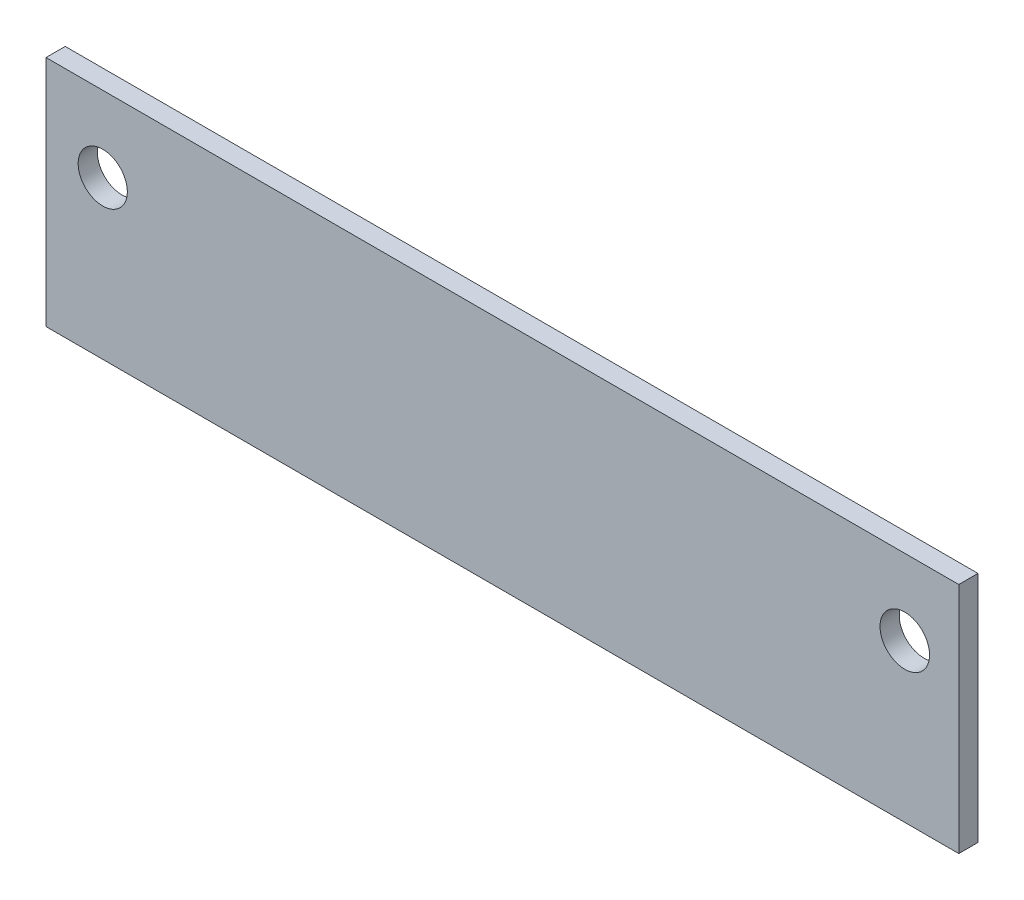
ISO-10303-21;
HEADER;
FILE_DESCRIPTION(('STEP AP214'),'2;1');
FILE_NAME('part.step','',(''),(''),'','','');
FILE_SCHEMA(('AUTOMOTIVE_DESIGN { 1 0 10303 214 1 1 1 1 }'));
ENDSEC;
DATA;
#1=APPLICATION_CONTEXT('core data for automotive mechanical design processes');
#2=APPLICATION_PROTOCOL_DEFINITION('international standard','automotive_design',2000,#1);
#3=PRODUCT_CONTEXT('',#1,'mechanical');
#4=PRODUCT('Part','Part','',(#3));
#5=PRODUCT_RELATED_PRODUCT_CATEGORY('part','',(#4));
#6=PRODUCT_DEFINITION_FORMATION('','',#4);
#7=PRODUCT_DEFINITION_CONTEXT('part definition',#1,'design');
#8=PRODUCT_DEFINITION('design','',#6,#7);
#9=PRODUCT_DEFINITION_SHAPE('','',#8);
#10=(LENGTH_UNIT() NAMED_UNIT(*) SI_UNIT(.MILLI.,.METRE.));
#11=(NAMED_UNIT(*) PLANE_ANGLE_UNIT() SI_UNIT($,.RADIAN.));
#12=(NAMED_UNIT(*) SI_UNIT($,.STERADIAN.) SOLID_ANGLE_UNIT());
#13=UNCERTAINTY_MEASURE_WITH_UNIT(LENGTH_MEASURE(1.E-05),#10,'distance_accuracy_value','');
#14=(GEOMETRIC_REPRESENTATION_CONTEXT(3) GLOBAL_UNCERTAINTY_ASSIGNED_CONTEXT((#13)) GLOBAL_UNIT_ASSIGNED_CONTEXT((#10,
#11,#12)) REPRESENTATION_CONTEXT('',''));
#15=CARTESIAN_POINT('',(0.,0.,0.));
#16=DIRECTION('',(0.,0.,1.));
#17=DIRECTION('',(1.,0.,0.));
#18=AXIS2_PLACEMENT_3D('',#15,#16,#17);
#19=CARTESIAN_POINT('',(0.,0.,2.54));
#20=DIRECTION('',(0.,0.,1.));
#21=DIRECTION('',(1.,0.,0.));
#22=AXIS2_PLACEMENT_3D('',#19,#20,#21);
#23=PLANE('',#22);
#24=CARTESIAN_POINT('',(53.,-10.,2.54));
#25=DIRECTION('',(0.,0.,1.));
#26=DIRECTION('',(1.,0.,0.));
#27=AXIS2_PLACEMENT_3D('',#24,#25,#26);
#28=CIRCLE('',#27,3.27342383058766);
#29=CARTESIAN_POINT('',(56.2734238305877,-10.,2.54));
#30=VERTEX_POINT('',#29);
#31=EDGE_CURVE('E101',#30,#30,#28,.T.);
#32=ORIENTED_EDGE('',*,*,#31,.F.);
#33=EDGE_LOOP('',(#32));
#34=FACE_BOUND('',#33,.T.);
#35=DIRECTION('',(0.,-1.,0.));
#36=VECTOR('',#35,1.);
#37=CARTESIAN_POINT('',(-60.5,0.,2.54));
#38=LINE('',#37,#36);
#39=CARTESIAN_POINT('',(-60.5,0.,2.54));
#40=VERTEX_POINT('',#39);
#41=CARTESIAN_POINT('',(-60.5,-30.7998094525956,2.54));
#42=VERTEX_POINT('',#41);
#43=EDGE_CURVE('E86',#40,#42,#38,.T.);
#44=ORIENTED_EDGE('',*,*,#43,.T.);
#45=DIRECTION('',(1.,0.,0.));
#46=VECTOR('',#45,1.);
#47=CARTESIAN_POINT('',(-60.5,-30.7998094525956,2.54));
#48=LINE('',#47,#46);
#49=CARTESIAN_POINT('',(60.1369498637041,-30.7998094525956,2.54));
#50=VERTEX_POINT('',#49);
#51=EDGE_CURVE('E81',#42,#50,#48,.T.);
#52=ORIENTED_EDGE('',*,*,#51,.T.);
#53=DIRECTION('',(0.,1.,0.));
#54=VECTOR('',#53,1.);
#55=CARTESIAN_POINT('',(60.1369498637041,0.,2.54));
#56=LINE('',#55,#54);
#57=CARTESIAN_POINT('',(60.1369498637041,0.,2.54));
#58=VERTEX_POINT('',#57);
#59=EDGE_CURVE('E84',#50,#58,#56,.T.);
#60=ORIENTED_EDGE('',*,*,#59,.T.);
#61=DIRECTION('',(-1.,0.,0.));
#62=VECTOR('',#61,1.);
#63=CARTESIAN_POINT('',(-60.5,0.,2.54));
#64=LINE('',#63,#62);
#65=EDGE_CURVE('E51',#58,#40,#64,.T.);
#66=ORIENTED_EDGE('',*,*,#65,.T.);
#67=EDGE_LOOP('',(#44,#52,#60,#66));
#68=FACE_BOUND('',#67,.T.);
#69=CARTESIAN_POINT('',(-53.,-10.,2.54));
#70=DIRECTION('',(0.,0.,1.));
#71=DIRECTION('',(1.,0.,0.));
#72=AXIS2_PLACEMENT_3D('',#69,#70,#71);
#73=CIRCLE('',#72,3.25);
#74=CARTESIAN_POINT('',(-49.75,-10.,2.54));
#75=VERTEX_POINT('',#74);
#76=EDGE_CURVE('E116',#75,#75,#73,.T.);
#77=ORIENTED_EDGE('',*,*,#76,.F.);
#78=EDGE_LOOP('',(#77));
#79=FACE_BOUND('',#78,.T.);
#80=ADVANCED_FACE('F34',(#34,#68,#79),#23,.T.);
#81=CARTESIAN_POINT('',(0.,0.,0.));
#82=DIRECTION('',(0.,0.,1.));
#83=DIRECTION('',(1.,0.,0.));
#84=AXIS2_PLACEMENT_3D('',#81,#82,#83);
#85=PLANE('',#84);
#86=DIRECTION('',(0.,-1.,0.));
#87=VECTOR('',#86,1.);
#88=CARTESIAN_POINT('',(-60.5,0.,0.));
#89=LINE('',#88,#87);
#90=CARTESIAN_POINT('',(-60.5,0.,0.));
#91=VERTEX_POINT('',#90);
#92=CARTESIAN_POINT('',(-60.5,-30.7998094525956,0.));
#93=VERTEX_POINT('',#92);
#94=EDGE_CURVE('E98',#91,#93,#89,.T.);
#95=ORIENTED_EDGE('',*,*,#94,.F.);
#96=DIRECTION('',(-1.,0.,0.));
#97=VECTOR('',#96,1.);
#98=CARTESIAN_POINT('',(-60.5,0.,0.));
#99=LINE('',#98,#97);
#100=CARTESIAN_POINT('',(60.1369498637041,0.,0.));
#101=VERTEX_POINT('',#100);
#102=EDGE_CURVE('E74',#101,#91,#99,.T.);
#103=ORIENTED_EDGE('',*,*,#102,.F.);
#104=DIRECTION('',(0.,1.,0.));
#105=VECTOR('',#104,1.);
#106=CARTESIAN_POINT('',(60.1369498637041,0.,0.));
#107=LINE('',#106,#105);
#108=CARTESIAN_POINT('',(60.1369498637041,-30.7998094525956,0.));
#109=VERTEX_POINT('',#108);
#110=EDGE_CURVE('E68',#109,#101,#107,.T.);
#111=ORIENTED_EDGE('',*,*,#110,.F.);
#112=DIRECTION('',(1.,0.,0.));
#113=VECTOR('',#112,1.);
#114=CARTESIAN_POINT('',(-60.5,-30.7998094525956,0.));
#115=LINE('',#114,#113);
#116=EDGE_CURVE('E90',#93,#109,#115,.T.);
#117=ORIENTED_EDGE('',*,*,#116,.F.);
#118=EDGE_LOOP('',(#95,#103,#111,#117));
#119=FACE_BOUND('',#118,.T.);
#120=CARTESIAN_POINT('',(53.,-10.,0.));
#121=DIRECTION('',(0.,0.,1.));
#122=DIRECTION('',(1.,0.,0.));
#123=AXIS2_PLACEMENT_3D('',#120,#121,#122);
#124=CIRCLE('',#123,3.27342383058766);
#125=CARTESIAN_POINT('',(56.2734238305877,-10.,0.));
#126=VERTEX_POINT('',#125);
#127=EDGE_CURVE('E113',#126,#126,#124,.T.);
#128=ORIENTED_EDGE('',*,*,#127,.T.);
#129=EDGE_LOOP('',(#128));
#130=FACE_BOUND('',#129,.T.);
#131=CARTESIAN_POINT('',(-53.,-10.,0.));
#132=DIRECTION('',(0.,0.,1.));
#133=DIRECTION('',(1.,0.,0.));
#134=AXIS2_PLACEMENT_3D('',#131,#132,#133);
#135=CIRCLE('',#134,3.25);
#136=CARTESIAN_POINT('',(-49.75,-10.,0.));
#137=VERTEX_POINT('',#136);
#138=EDGE_CURVE('E119',#137,#137,#135,.T.);
#139=ORIENTED_EDGE('',*,*,#138,.T.);
#140=EDGE_LOOP('',(#139));
#141=FACE_BOUND('',#140,.T.);
#142=ADVANCED_FACE('F109',(#119,#130,#141),#85,.F.);
#143=CARTESIAN_POINT('',(-60.5,0.,2.54));
#144=DIRECTION('',(1.,0.,0.));
#145=DIRECTION('',(0.,1.,0.));
#146=AXIS2_PLACEMENT_3D('',#143,#144,#145);
#147=PLANE('',#146);
#148=ORIENTED_EDGE('',*,*,#94,.T.);
#149=DIRECTION('',(0.,0.,-1.));
#150=VECTOR('',#149,1.);
#151=CARTESIAN_POINT('',(-60.5,-30.7998094525956,2.54));
#152=LINE('',#151,#150);
#153=EDGE_CURVE('E11',#42,#93,#152,.T.);
#154=ORIENTED_EDGE('',*,*,#153,.F.);
#155=ORIENTED_EDGE('',*,*,#43,.F.);
#156=DIRECTION('',(0.,0.,-1.));
#157=VECTOR('',#156,1.);
#158=CARTESIAN_POINT('',(-60.5,0.,2.54));
#159=LINE('',#158,#157);
#160=EDGE_CURVE('E94',#40,#91,#159,.T.);
#161=ORIENTED_EDGE('',*,*,#160,.T.);
#162=EDGE_LOOP('',(#148,#154,#155,#161));
#163=FACE_BOUND('',#162,.T.);
#164=ADVANCED_FACE('F36',(#163),#147,.F.);
#165=CARTESIAN_POINT('',(-60.5,-30.7998094525956,2.54));
#166=DIRECTION('',(0.,1.,0.));
#167=DIRECTION('',(0.,0.,1.));
#168=AXIS2_PLACEMENT_3D('',#165,#166,#167);
#169=PLANE('',#168);
#170=ORIENTED_EDGE('',*,*,#116,.T.);
#171=DIRECTION('',(0.,0.,-1.));
#172=VECTOR('',#171,1.);
#173=CARTESIAN_POINT('',(60.1369498637041,-30.7998094525956,2.54));
#174=LINE('',#173,#172);
#175=EDGE_CURVE('E43',#50,#109,#174,.T.);
#176=ORIENTED_EDGE('',*,*,#175,.F.);
#177=ORIENTED_EDGE('',*,*,#51,.F.);
#178=ORIENTED_EDGE('',*,*,#153,.T.);
#179=EDGE_LOOP('',(#170,#176,#177,#178));
#180=FACE_BOUND('',#179,.T.);
#181=ADVANCED_FACE('F89',(#180),#169,.F.);
#182=CARTESIAN_POINT('',(60.1369498637041,0.,2.54));
#183=DIRECTION('',(-1.,0.,0.));
#184=DIRECTION('',(0.,0.,1.));
#185=AXIS2_PLACEMENT_3D('',#182,#183,#184);
#186=PLANE('',#185);
#187=ORIENTED_EDGE('',*,*,#110,.T.);
#188=DIRECTION('',(0.,0.,-1.));
#189=VECTOR('',#188,1.);
#190=CARTESIAN_POINT('',(60.1369498637041,0.,2.54));
#191=LINE('',#190,#189);
#192=EDGE_CURVE('E91',#58,#101,#191,.T.);
#193=ORIENTED_EDGE('',*,*,#192,.F.);
#194=ORIENTED_EDGE('',*,*,#59,.F.);
#195=ORIENTED_EDGE('',*,*,#175,.T.);
#196=EDGE_LOOP('',(#187,#193,#194,#195));
#197=FACE_BOUND('',#196,.T.);
#198=ADVANCED_FACE('F92',(#197),#186,.F.);
#199=CARTESIAN_POINT('',(-60.5,0.,2.54));
#200=DIRECTION('',(0.,-1.,0.));
#201=DIRECTION('',(1.,0.,0.));
#202=AXIS2_PLACEMENT_3D('',#199,#200,#201);
#203=PLANE('',#202);
#204=ORIENTED_EDGE('',*,*,#102,.T.);
#205=ORIENTED_EDGE('',*,*,#160,.F.);
#206=ORIENTED_EDGE('',*,*,#65,.F.);
#207=ORIENTED_EDGE('',*,*,#192,.T.);
#208=EDGE_LOOP('',(#204,#205,#206,#207));
#209=FACE_BOUND('',#208,.T.);
#210=ADVANCED_FACE('F106',(#209),#203,.F.);
#211=CARTESIAN_POINT('',(53.,-10.,2.54));
#212=DIRECTION('',(0.,0.,-1.));
#213=DIRECTION('',(-1.,0.,0.));
#214=AXIS2_PLACEMENT_3D('',#211,#212,#213);
#215=CYLINDRICAL_SURFACE('',#214,3.27342383058766);
#216=ORIENTED_EDGE('',*,*,#31,.T.);
#217=EDGE_LOOP('',(#216));
#218=FACE_BOUND('',#217,.T.);
#219=ORIENTED_EDGE('',*,*,#127,.F.);
#220=EDGE_LOOP('',(#219));
#221=FACE_BOUND('',#220,.T.);
#222=ADVANCED_FACE('F136',(#218,#221),#215,.F.);
#223=CARTESIAN_POINT('',(-53.,-10.,2.54));
#224=DIRECTION('',(0.,0.,-1.));
#225=DIRECTION('',(-1.,0.,0.));
#226=AXIS2_PLACEMENT_3D('',#223,#224,#225);
#227=CYLINDRICAL_SURFACE('',#226,3.25);
#228=ORIENTED_EDGE('',*,*,#76,.T.);
#229=EDGE_LOOP('',(#228));
#230=FACE_BOUND('',#229,.T.);
#231=ORIENTED_EDGE('',*,*,#138,.F.);
#232=EDGE_LOOP('',(#231));
#233=FACE_BOUND('',#232,.T.);
#234=ADVANCED_FACE('F125',(#230,#233),#227,.F.);
#235=CLOSED_SHELL('',(#80,#142,#164,#181,#198,#210,#222,#234));
#236=MANIFOLD_SOLID_BREP('B2',#235);
#237=ADVANCED_BREP_SHAPE_REPRESENTATION('',(#18,#236),#14);
#238=SHAPE_DEFINITION_REPRESENTATION(#9,#237);
ENDSEC;
END-ISO-10303-21;
